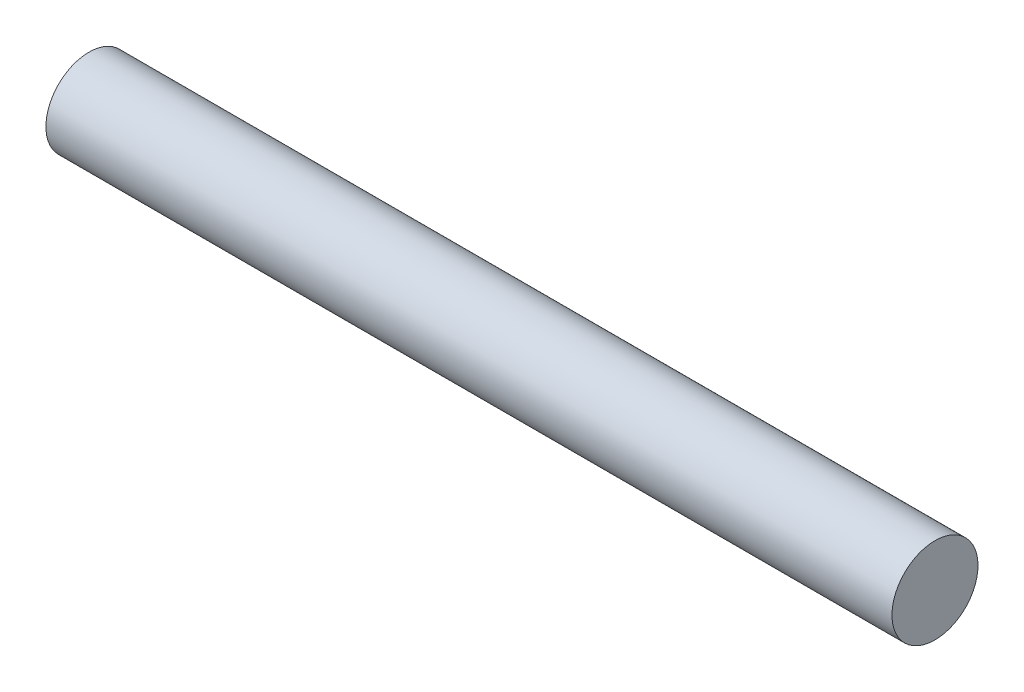
ISO-10303-21;
HEADER;
FILE_DESCRIPTION(('STEP AP214'),'2;1');
FILE_NAME('part.step','',(''),(''),'','','');
FILE_SCHEMA(('AUTOMOTIVE_DESIGN { 1 0 10303 214 1 1 1 1 }'));
ENDSEC;
DATA;
#1=APPLICATION_CONTEXT('core data for automotive mechanical design processes');
#2=APPLICATION_PROTOCOL_DEFINITION('international standard','automotive_design',2000,#1);
#3=PRODUCT_CONTEXT('',#1,'mechanical');
#4=PRODUCT('Part','Part','',(#3));
#5=PRODUCT_RELATED_PRODUCT_CATEGORY('part','',(#4));
#6=PRODUCT_DEFINITION_FORMATION('','',#4);
#7=PRODUCT_DEFINITION_CONTEXT('part definition',#1,'design');
#8=PRODUCT_DEFINITION('design','',#6,#7);
#9=PRODUCT_DEFINITION_SHAPE('','',#8);
#10=(LENGTH_UNIT() NAMED_UNIT(*) SI_UNIT(.MILLI.,.METRE.));
#11=(NAMED_UNIT(*) PLANE_ANGLE_UNIT() SI_UNIT($,.RADIAN.));
#12=(NAMED_UNIT(*) SI_UNIT($,.STERADIAN.) SOLID_ANGLE_UNIT());
#13=UNCERTAINTY_MEASURE_WITH_UNIT(LENGTH_MEASURE(1.E-05),#10,'distance_accuracy_value','');
#14=(GEOMETRIC_REPRESENTATION_CONTEXT(3) GLOBAL_UNCERTAINTY_ASSIGNED_CONTEXT((#13)) GLOBAL_UNIT_ASSIGNED_CONTEXT((#10,
#11,#12)) REPRESENTATION_CONTEXT('',''));
#15=CARTESIAN_POINT('',(0.,0.,0.));
#16=DIRECTION('',(0.,0.,1.));
#17=DIRECTION('',(1.,0.,0.));
#18=AXIS2_PLACEMENT_3D('',#15,#16,#17);
#19=CARTESIAN_POINT('',(387.5,-27.1757017592288,-50.4633861514474));
#20=DIRECTION('',(-1.,0.,0.));
#21=DIRECTION('',(0.,0.,1.));
#22=AXIS2_PLACEMENT_3D('',#19,#20,#21);
#23=PLANE('',#22);
#24=CARTESIAN_POINT('',(387.5,-0.0161603309483064,-35.4633861514474));
#25=DIRECTION('',(1.,0.,0.));
#26=DIRECTION('',(0.,0.,-1.));
#27=AXIS2_PLACEMENT_3D('',#24,#25,#26);
#28=CIRCLE('',#27,15.);
#29=CARTESIAN_POINT('',(387.5,-0.0161603309483064,-50.4633861514474));
#30=VERTEX_POINT('',#29);
#31=EDGE_CURVE('E10',#30,#30,#28,.T.);
#32=ORIENTED_EDGE('',*,*,#31,.T.);
#33=EDGE_LOOP('',(#32));
#34=FACE_BOUND('',#33,.T.);
#35=ADVANCED_FACE('F36',(#34),#23,.F.);
#36=CARTESIAN_POINT('',(92.5000000000007,-27.1757017592288,-50.4633861514474));
#37=DIRECTION('',(-1.,0.,0.));
#38=DIRECTION('',(0.,0.,1.));
#39=AXIS2_PLACEMENT_3D('',#36,#37,#38);
#40=PLANE('',#39);
#41=CARTESIAN_POINT('',(92.5,-0.0161603309483064,-35.4633861514474));
#42=DIRECTION('',(1.,0.,0.));
#43=DIRECTION('',(0.,0.,-1.));
#44=AXIS2_PLACEMENT_3D('',#41,#42,#43);
#45=CIRCLE('',#44,15.);
#46=CARTESIAN_POINT('',(92.5,-0.0161603309483064,-50.4633861514474));
#47=VERTEX_POINT('',#46);
#48=EDGE_CURVE('E41',#47,#47,#45,.T.);
#49=ORIENTED_EDGE('',*,*,#48,.F.);
#50=EDGE_LOOP('',(#49));
#51=FACE_BOUND('',#50,.T.);
#52=ADVANCED_FACE('F52',(#51),#40,.T.);
#53=CARTESIAN_POINT('',(240.,-0.0161603309483064,-35.4633861514474));
#54=DIRECTION('',(-1.,0.,0.));
#55=DIRECTION('',(0.,0.,1.));
#56=AXIS2_PLACEMENT_3D('',#53,#54,#55);
#57=CYLINDRICAL_SURFACE('',#56,15.);
#58=ORIENTED_EDGE('',*,*,#48,.T.);
#59=EDGE_LOOP('',(#58));
#60=FACE_BOUND('',#59,.T.);
#61=ORIENTED_EDGE('',*,*,#31,.F.);
#62=EDGE_LOOP('',(#61));
#63=FACE_BOUND('',#62,.T.);
#64=ADVANCED_FACE('F49',(#60,#63),#57,.T.);
#65=CLOSED_SHELL('',(#35,#52,#64));
#66=MANIFOLD_SOLID_BREP('B2',#65);
#67=ADVANCED_BREP_SHAPE_REPRESENTATION('',(#18,#66),#14);
#68=SHAPE_DEFINITION_REPRESENTATION(#9,#67);
ENDSEC;
END-ISO-10303-21;
